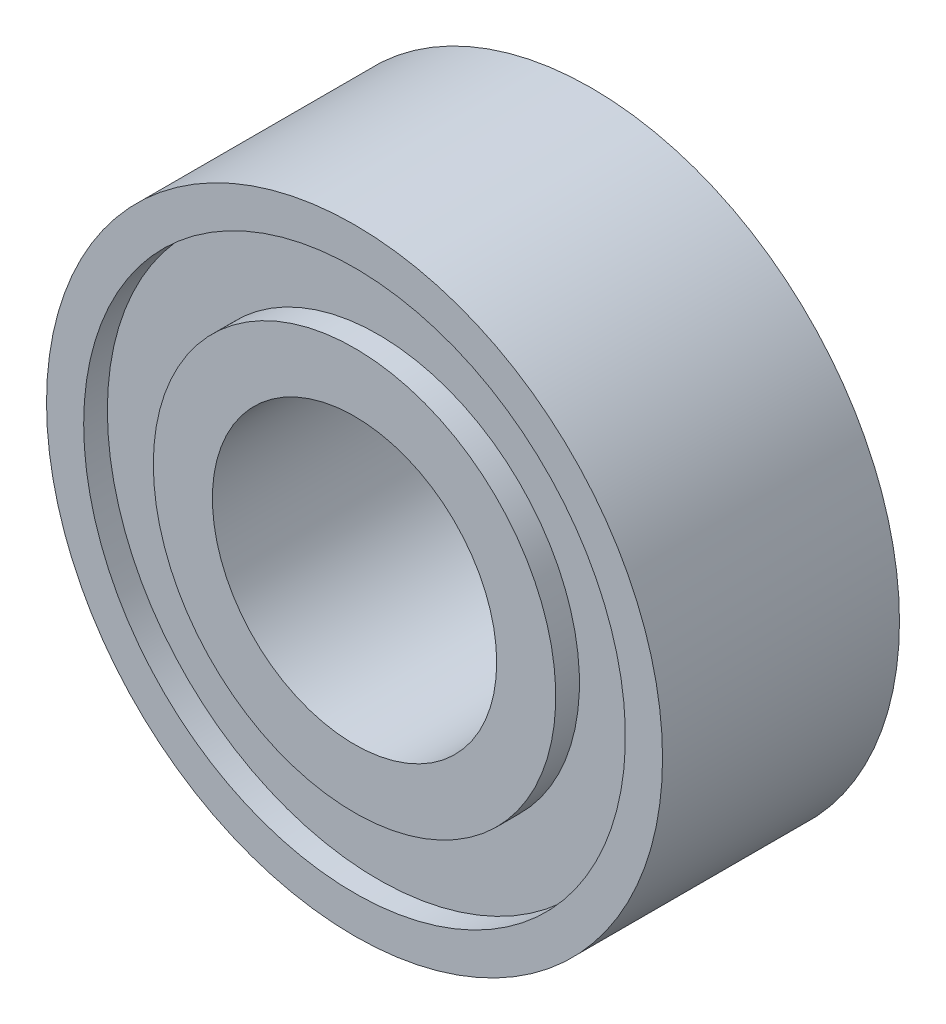
ISO-10303-21;
HEADER;
FILE_DESCRIPTION(('STEP AP214'),'2;1');
FILE_NAME('part.step','',(''),(''),'','','');
FILE_SCHEMA(('AUTOMOTIVE_DESIGN { 1 0 10303 214 1 1 1 1 }'));
ENDSEC;
DATA;
#1=APPLICATION_CONTEXT('core data for automotive mechanical design processes');
#2=APPLICATION_PROTOCOL_DEFINITION('international standard','automotive_design',2000,#1);
#3=PRODUCT_CONTEXT('',#1,'mechanical');
#4=PRODUCT('Part','Part','',(#3));
#5=PRODUCT_RELATED_PRODUCT_CATEGORY('part','',(#4));
#6=PRODUCT_DEFINITION_FORMATION('','',#4);
#7=PRODUCT_DEFINITION_CONTEXT('part definition',#1,'design');
#8=PRODUCT_DEFINITION('design','',#6,#7);
#9=PRODUCT_DEFINITION_SHAPE('','',#8);
#10=(LENGTH_UNIT() NAMED_UNIT(*) SI_UNIT(.MILLI.,.METRE.));
#11=(NAMED_UNIT(*) PLANE_ANGLE_UNIT() SI_UNIT($,.RADIAN.));
#12=(NAMED_UNIT(*) SI_UNIT($,.STERADIAN.) SOLID_ANGLE_UNIT());
#13=UNCERTAINTY_MEASURE_WITH_UNIT(LENGTH_MEASURE(1.E-05),#10,'distance_accuracy_value','');
#14=(GEOMETRIC_REPRESENTATION_CONTEXT(3) GLOBAL_UNCERTAINTY_ASSIGNED_CONTEXT((#13)) GLOBAL_UNIT_ASSIGNED_CONTEXT((#10,
#11,#12)) REPRESENTATION_CONTEXT('',''));
#15=CARTESIAN_POINT('',(0.,0.,0.));
#16=DIRECTION('',(0.,0.,1.));
#17=DIRECTION('',(1.,0.,0.));
#18=AXIS2_PLACEMENT_3D('',#15,#16,#17);
#19=CARTESIAN_POINT('',(0.,0.,2.5));
#20=DIRECTION('',(0.,0.,1.));
#21=DIRECTION('',(1.,0.,0.));
#22=AXIS2_PLACEMENT_3D('',#19,#20,#21);
#23=PLANE('',#22);
#24=CARTESIAN_POINT('',(0.,0.,2.5));
#25=DIRECTION('',(0.,0.,1.));
#26=DIRECTION('',(1.,0.,0.));
#27=AXIS2_PLACEMENT_3D('',#24,#25,#26);
#28=CIRCLE('',#27,6.5);
#29=CARTESIAN_POINT('',(6.5,0.,2.5));
#30=VERTEX_POINT('',#29);
#31=EDGE_CURVE('E10',#30,#30,#28,.T.);
#32=ORIENTED_EDGE('',*,*,#31,.T.);
#33=EDGE_LOOP('',(#32));
#34=FACE_BOUND('',#33,.T.);
#35=CARTESIAN_POINT('',(0.,0.,2.5));
#36=DIRECTION('',(0.,0.,-1.));
#37=DIRECTION('',(-1.,0.,0.));
#38=AXIS2_PLACEMENT_3D('',#35,#36,#37);
#39=CIRCLE('',#38,5.71605036206564);
#40=CARTESIAN_POINT('',(-5.71605036206564,0.,2.5));
#41=VERTEX_POINT('',#40);
#42=EDGE_CURVE('E63',#41,#41,#39,.T.);
#43=ORIENTED_EDGE('',*,*,#42,.T.);
#44=EDGE_LOOP('',(#43));
#45=FACE_BOUND('',#44,.T.);
#46=ADVANCED_FACE('F32',(#34,#45),#23,.T.);
#47=CARTESIAN_POINT('',(0.,0.,-2.5));
#48=DIRECTION('',(0.,0.,1.));
#49=DIRECTION('',(1.,0.,0.));
#50=AXIS2_PLACEMENT_3D('',#47,#48,#49);
#51=PLANE('',#50);
#52=CARTESIAN_POINT('',(0.,0.,-2.5));
#53=DIRECTION('',(0.,0.,1.));
#54=DIRECTION('',(1.,0.,0.));
#55=AXIS2_PLACEMENT_3D('',#52,#53,#54);
#56=CIRCLE('',#55,3.);
#57=CARTESIAN_POINT('',(3.,0.,-2.5));
#58=VERTEX_POINT('',#57);
#59=EDGE_CURVE('E45',#58,#58,#56,.T.);
#60=ORIENTED_EDGE('',*,*,#59,.T.);
#61=EDGE_LOOP('',(#60));
#62=FACE_BOUND('',#61,.T.);
#63=CARTESIAN_POINT('',(0.,0.,-2.5));
#64=DIRECTION('',(0.,0.,-1.));
#65=DIRECTION('',(-1.,0.,0.));
#66=AXIS2_PLACEMENT_3D('',#63,#64,#65);
#67=CIRCLE('',#66,4.24621304997266);
#68=CARTESIAN_POINT('',(-4.24621304997266,0.,-2.5));
#69=VERTEX_POINT('',#68);
#70=EDGE_CURVE('E57',#69,#69,#67,.T.);
#71=ORIENTED_EDGE('',*,*,#70,.T.);
#72=EDGE_LOOP('',(#71));
#73=FACE_BOUND('',#72,.T.);
#74=ADVANCED_FACE('F88',(#62,#73),#51,.F.);
#75=CARTESIAN_POINT('',(0.,0.,2.5));
#76=DIRECTION('',(0.,0.,-1.));
#77=DIRECTION('',(-1.,0.,0.));
#78=AXIS2_PLACEMENT_3D('',#75,#76,#77);
#79=CIRCLE('',#78,4.24621304997266);
#80=CARTESIAN_POINT('',(-4.24621304997266,0.,2.5));
#81=VERTEX_POINT('',#80);
#82=EDGE_CURVE('E69',#81,#81,#79,.T.);
#83=ORIENTED_EDGE('',*,*,#82,.F.);
#84=EDGE_LOOP('',(#83));
#85=FACE_BOUND('',#84,.T.);
#86=CARTESIAN_POINT('',(0.,0.,2.5));
#87=DIRECTION('',(0.,0.,1.));
#88=DIRECTION('',(1.,0.,0.));
#89=AXIS2_PLACEMENT_3D('',#86,#87,#88);
#90=CIRCLE('',#89,3.);
#91=CARTESIAN_POINT('',(3.,0.,2.5));
#92=VERTEX_POINT('',#91);
#93=EDGE_CURVE('E43',#92,#92,#90,.T.);
#94=ORIENTED_EDGE('',*,*,#93,.F.);
#95=EDGE_LOOP('',(#94));
#96=FACE_BOUND('',#95,.T.);
#97=ADVANCED_FACE('F84',(#85,#96),#23,.T.);
#98=CARTESIAN_POINT('',(0.,0.,-2.5));
#99=DIRECTION('',(0.,0.,-1.));
#100=DIRECTION('',(-1.,0.,0.));
#101=AXIS2_PLACEMENT_3D('',#98,#99,#100);
#102=CIRCLE('',#101,5.71605036206564);
#103=CARTESIAN_POINT('',(-5.71605036206564,0.,-2.5));
#104=VERTEX_POINT('',#103);
#105=EDGE_CURVE('E51',#104,#104,#102,.T.);
#106=ORIENTED_EDGE('',*,*,#105,.F.);
#107=EDGE_LOOP('',(#106));
#108=FACE_BOUND('',#107,.T.);
#109=CARTESIAN_POINT('',(0.,0.,-2.5));
#110=DIRECTION('',(0.,0.,1.));
#111=DIRECTION('',(1.,0.,0.));
#112=AXIS2_PLACEMENT_3D('',#109,#110,#111);
#113=CIRCLE('',#112,6.5);
#114=CARTESIAN_POINT('',(6.5,0.,-2.5));
#115=VERTEX_POINT('',#114);
#116=EDGE_CURVE('E36',#115,#115,#113,.T.);
#117=ORIENTED_EDGE('',*,*,#116,.F.);
#118=EDGE_LOOP('',(#117));
#119=FACE_BOUND('',#118,.T.);
#120=ADVANCED_FACE('F87',(#108,#119),#51,.F.);
#121=CARTESIAN_POINT('',(0.,0.,2.5));
#122=DIRECTION('',(0.,0.,-1.));
#123=DIRECTION('',(-1.,0.,0.));
#124=AXIS2_PLACEMENT_3D('',#121,#122,#123);
#125=CYLINDRICAL_SURFACE('',#124,6.5);
#126=ORIENTED_EDGE('',*,*,#31,.F.);
#127=EDGE_LOOP('',(#126));
#128=FACE_BOUND('',#127,.T.);
#129=ORIENTED_EDGE('',*,*,#116,.T.);
#130=EDGE_LOOP('',(#129));
#131=FACE_BOUND('',#130,.T.);
#132=ADVANCED_FACE('F34',(#128,#131),#125,.T.);
#133=CARTESIAN_POINT('',(0.,0.,2.5));
#134=DIRECTION('',(0.,0.,-1.));
#135=DIRECTION('',(-1.,0.,0.));
#136=AXIS2_PLACEMENT_3D('',#133,#134,#135);
#137=CYLINDRICAL_SURFACE('',#136,3.);
#138=ORIENTED_EDGE('',*,*,#93,.T.);
#139=EDGE_LOOP('',(#138));
#140=FACE_BOUND('',#139,.T.);
#141=ORIENTED_EDGE('',*,*,#59,.F.);
#142=EDGE_LOOP('',(#141));
#143=FACE_BOUND('',#142,.T.);
#144=ADVANCED_FACE('F92',(#140,#143),#137,.F.);
#145=CARTESIAN_POINT('',(0.,0.,-2.));
#146=DIRECTION('',(0.,0.,-1.));
#147=DIRECTION('',(-1.,0.,0.));
#148=AXIS2_PLACEMENT_3D('',#145,#146,#147);
#149=CYLINDRICAL_SURFACE('',#148,5.71605036206564);
#150=CARTESIAN_POINT('',(0.,0.,-2.));
#151=DIRECTION('',(0.,0.,-1.));
#152=DIRECTION('',(-1.,0.,0.));
#153=AXIS2_PLACEMENT_3D('',#150,#151,#152);
#154=CIRCLE('',#153,5.71605036206564);
#155=CARTESIAN_POINT('',(-5.71605036206564,0.,-2.));
#156=VERTEX_POINT('',#155);
#157=EDGE_CURVE('E48',#156,#156,#154,.T.);
#158=ORIENTED_EDGE('',*,*,#157,.F.);
#159=EDGE_LOOP('',(#158));
#160=FACE_BOUND('',#159,.T.);
#161=ORIENTED_EDGE('',*,*,#105,.T.);
#162=EDGE_LOOP('',(#161));
#163=FACE_BOUND('',#162,.T.);
#164=ADVANCED_FACE('F95',(#160,#163),#149,.F.);
#165=CARTESIAN_POINT('',(0.,0.,-2.));
#166=DIRECTION('',(0.,0.,-1.));
#167=DIRECTION('',(-1.,0.,0.));
#168=AXIS2_PLACEMENT_3D('',#165,#166,#167);
#169=PLANE('',#168);
#170=CARTESIAN_POINT('',(0.,0.,-2.));
#171=DIRECTION('',(0.,0.,-1.));
#172=DIRECTION('',(-1.,0.,0.));
#173=AXIS2_PLACEMENT_3D('',#170,#171,#172);
#174=CIRCLE('',#173,4.24621304997266);
#175=CARTESIAN_POINT('',(-4.24621304997266,0.,-2.));
#176=VERTEX_POINT('',#175);
#177=EDGE_CURVE('E54',#176,#176,#174,.T.);
#178=ORIENTED_EDGE('',*,*,#177,.F.);
#179=EDGE_LOOP('',(#178));
#180=FACE_BOUND('',#179,.T.);
#181=ORIENTED_EDGE('',*,*,#157,.T.);
#182=EDGE_LOOP('',(#181));
#183=FACE_BOUND('',#182,.T.);
#184=ADVANCED_FACE('F105',(#180,#183),#169,.T.);
#185=CARTESIAN_POINT('',(0.,0.,-2.));
#186=DIRECTION('',(0.,0.,-1.));
#187=DIRECTION('',(-1.,0.,0.));
#188=AXIS2_PLACEMENT_3D('',#185,#186,#187);
#189=CYLINDRICAL_SURFACE('',#188,4.24621304997266);
#190=ORIENTED_EDGE('',*,*,#177,.T.);
#191=EDGE_LOOP('',(#190));
#192=FACE_BOUND('',#191,.T.);
#193=ORIENTED_EDGE('',*,*,#70,.F.);
#194=EDGE_LOOP('',(#193));
#195=FACE_BOUND('',#194,.T.);
#196=ADVANCED_FACE('F103',(#192,#195),#189,.T.);
#197=CARTESIAN_POINT('',(0.,0.,2.));
#198=DIRECTION('',(0.,0.,1.));
#199=DIRECTION('',(-1.,0.,0.));
#200=AXIS2_PLACEMENT_3D('',#197,#198,#199);
#201=PLANE('',#200);
#202=CARTESIAN_POINT('',(0.,0.,2.));
#203=DIRECTION('',(0.,0.,-1.));
#204=DIRECTION('',(-1.,0.,0.));
#205=AXIS2_PLACEMENT_3D('',#202,#203,#204);
#206=CIRCLE('',#205,5.71605036206564);
#207=CARTESIAN_POINT('',(-5.71605036206564,0.,2.));
#208=VERTEX_POINT('',#207);
#209=EDGE_CURVE('E60',#208,#208,#206,.T.);
#210=ORIENTED_EDGE('',*,*,#209,.F.);
#211=EDGE_LOOP('',(#210));
#212=FACE_BOUND('',#211,.T.);
#213=CARTESIAN_POINT('',(0.,0.,2.));
#214=DIRECTION('',(0.,0.,-1.));
#215=DIRECTION('',(-1.,0.,0.));
#216=AXIS2_PLACEMENT_3D('',#213,#214,#215);
#217=CIRCLE('',#216,4.24621304997266);
#218=CARTESIAN_POINT('',(-4.24621304997266,0.,2.));
#219=VERTEX_POINT('',#218);
#220=EDGE_CURVE('E66',#219,#219,#217,.T.);
#221=ORIENTED_EDGE('',*,*,#220,.T.);
#222=EDGE_LOOP('',(#221));
#223=FACE_BOUND('',#222,.T.);
#224=ADVANCED_FACE('F75',(#212,#223),#201,.T.);
#225=CARTESIAN_POINT('',(0.,0.,2.));
#226=DIRECTION('',(0.,0.,1.));
#227=DIRECTION('',(1.,0.,0.));
#228=AXIS2_PLACEMENT_3D('',#225,#226,#227);
#229=CYLINDRICAL_SURFACE('',#228,5.71605036206564);
#230=ORIENTED_EDGE('',*,*,#209,.T.);
#231=EDGE_LOOP('',(#230));
#232=FACE_BOUND('',#231,.T.);
#233=ORIENTED_EDGE('',*,*,#42,.F.);
#234=EDGE_LOOP('',(#233));
#235=FACE_BOUND('',#234,.T.);
#236=ADVANCED_FACE('F80',(#232,#235),#229,.F.);
#237=CARTESIAN_POINT('',(0.,0.,2.));
#238=DIRECTION('',(0.,0.,1.));
#239=DIRECTION('',(1.,0.,0.));
#240=AXIS2_PLACEMENT_3D('',#237,#238,#239);
#241=CYLINDRICAL_SURFACE('',#240,4.24621304997266);
#242=ORIENTED_EDGE('',*,*,#220,.F.);
#243=EDGE_LOOP('',(#242));
#244=FACE_BOUND('',#243,.T.);
#245=ORIENTED_EDGE('',*,*,#82,.T.);
#246=EDGE_LOOP('',(#245));
#247=FACE_BOUND('',#246,.T.);
#248=ADVANCED_FACE('F77',(#244,#247),#241,.T.);
#249=CLOSED_SHELL('',(#46,#74,#97,#120,#132,#144,#164,#184,#196,#224,#236,#248));
#250=MANIFOLD_SOLID_BREP('B2',#249);
#251=ADVANCED_BREP_SHAPE_REPRESENTATION('',(#18,#250),#14);
#252=SHAPE_DEFINITION_REPRESENTATION(#9,#251);
ENDSEC;
END-ISO-10303-21;
